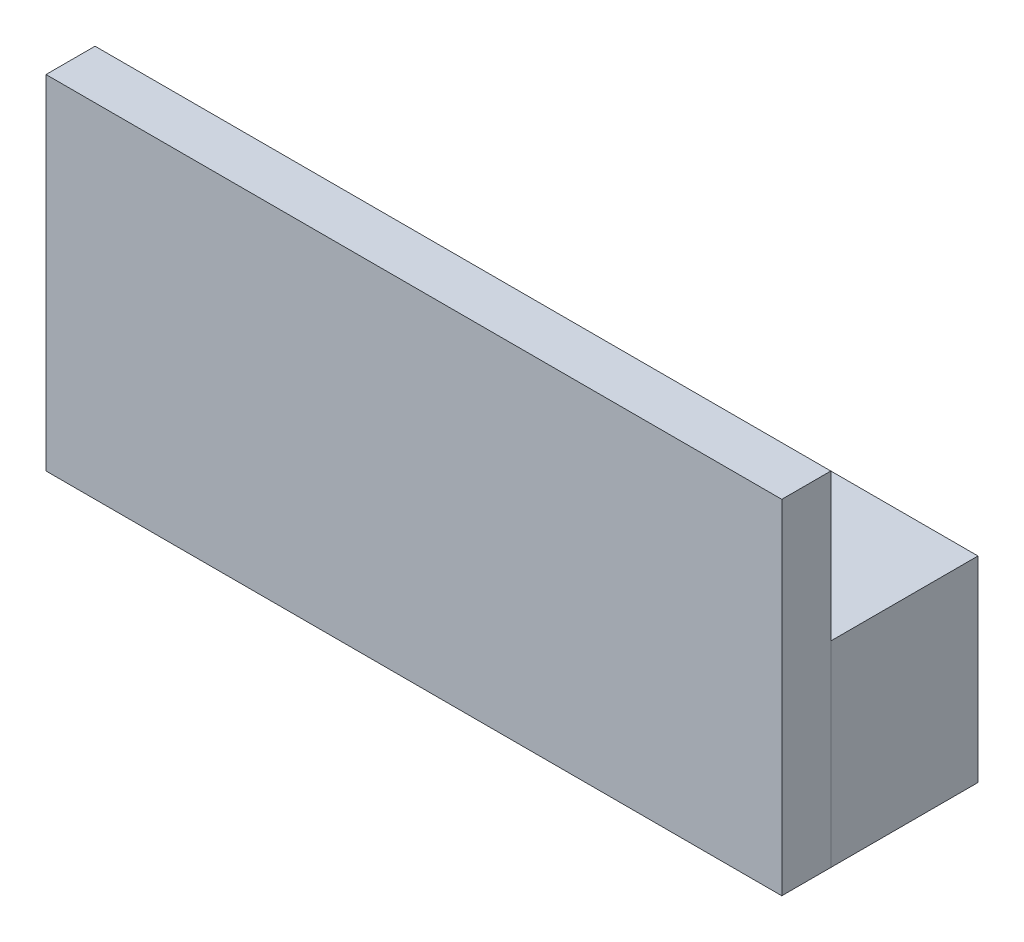
ISO-10303-21;
HEADER;
FILE_DESCRIPTION(('STEP AP214'),'2;1');
FILE_NAME('part.step','',(''),(''),'','','');
FILE_SCHEMA(('AUTOMOTIVE_DESIGN { 1 0 10303 214 1 1 1 1 }'));
ENDSEC;
DATA;
#1=APPLICATION_CONTEXT('core data for automotive mechanical design processes');
#2=APPLICATION_PROTOCOL_DEFINITION('international standard','automotive_design',2000,#1);
#3=PRODUCT_CONTEXT('',#1,'mechanical');
#4=PRODUCT('Part','Part','',(#3));
#5=PRODUCT_RELATED_PRODUCT_CATEGORY('part','',(#4));
#6=PRODUCT_DEFINITION_FORMATION('','',#4);
#7=PRODUCT_DEFINITION_CONTEXT('part definition',#1,'design');
#8=PRODUCT_DEFINITION('design','',#6,#7);
#9=PRODUCT_DEFINITION_SHAPE('','',#8);
#10=(LENGTH_UNIT() NAMED_UNIT(*) SI_UNIT(.MILLI.,.METRE.));
#11=(NAMED_UNIT(*) PLANE_ANGLE_UNIT() SI_UNIT($,.RADIAN.));
#12=(NAMED_UNIT(*) SI_UNIT($,.STERADIAN.) SOLID_ANGLE_UNIT());
#13=UNCERTAINTY_MEASURE_WITH_UNIT(LENGTH_MEASURE(1.E-05),#10,'distance_accuracy_value','');
#14=(GEOMETRIC_REPRESENTATION_CONTEXT(3) GLOBAL_UNCERTAINTY_ASSIGNED_CONTEXT((#13)) GLOBAL_UNIT_ASSIGNED_CONTEXT((#10,
#11,#12)) REPRESENTATION_CONTEXT('',''));
#15=CARTESIAN_POINT('',(0.,0.,0.));
#16=DIRECTION('',(0.,0.,1.));
#17=DIRECTION('',(1.,0.,0.));
#18=AXIS2_PLACEMENT_3D('',#15,#16,#17);
#19=CARTESIAN_POINT('',(10.,-10.,15.));
#20=DIRECTION('',(1.,0.,0.));
#21=DIRECTION('',(0.,1.,0.));
#22=AXIS2_PLACEMENT_3D('',#19,#20,#21);
#23=PLANE('',#22);
#24=DIRECTION('',(0.,1.,0.));
#25=VECTOR('',#24,1.);
#26=CARTESIAN_POINT('',(10.,-10.,20.));
#27=LINE('',#26,#25);
#28=CARTESIAN_POINT('',(10.,-10.,20.));
#29=VERTEX_POINT('',#28);
#30=CARTESIAN_POINT('',(10.,25.,20.));
#31=VERTEX_POINT('',#30);
#32=EDGE_CURVE('E115',#29,#31,#27,.T.);
#33=ORIENTED_EDGE('',*,*,#32,.F.);
#34=DIRECTION('',(0.,0.,1.));
#35=VECTOR('',#34,1.);
#36=CARTESIAN_POINT('',(10.,-10.,15.));
#37=LINE('',#36,#35);
#38=CARTESIAN_POINT('',(10.,-10.,15.));
#39=VERTEX_POINT('',#38);
#40=EDGE_CURVE('E12',#39,#29,#37,.T.);
#41=ORIENTED_EDGE('',*,*,#40,.F.);
#42=DIRECTION('',(0.,1.,0.));
#43=VECTOR('',#42,1.);
#44=CARTESIAN_POINT('',(10.,-10.,15.));
#45=LINE('',#44,#43);
#46=CARTESIAN_POINT('',(10.,25.,15.));
#47=VERTEX_POINT('',#46);
#48=EDGE_CURVE('E109',#39,#47,#45,.T.);
#49=ORIENTED_EDGE('',*,*,#48,.T.);
#50=DIRECTION('',(0.,0.,1.));
#51=VECTOR('',#50,1.);
#52=CARTESIAN_POINT('',(10.,25.,15.));
#53=LINE('',#52,#51);
#54=EDGE_CURVE('E54',#47,#31,#53,.T.);
#55=ORIENTED_EDGE('',*,*,#54,.T.);
#56=EDGE_LOOP('',(#33,#41,#49,#55));
#57=FACE_BOUND('',#56,.T.);
#58=ADVANCED_FACE('F51',(#57),#23,.T.);
#59=CARTESIAN_POINT('',(10.,-10.,15.));
#60=DIRECTION('',(0.,-1.,0.));
#61=DIRECTION('',(1.,0.,0.));
#62=AXIS2_PLACEMENT_3D('',#59,#60,#61);
#63=PLANE('',#62);
#64=DIRECTION('',(1.,0.,0.));
#65=VECTOR('',#64,1.);
#66=CARTESIAN_POINT('',(10.,-10.,20.));
#67=LINE('',#66,#65);
#68=CARTESIAN_POINT('',(-65.,-10.,20.));
#69=VERTEX_POINT('',#68);
#70=EDGE_CURVE('E111',#69,#29,#67,.T.);
#71=ORIENTED_EDGE('',*,*,#70,.F.);
#72=DIRECTION('',(0.,0.,1.));
#73=VECTOR('',#72,1.);
#74=CARTESIAN_POINT('',(-65.,-10.,15.));
#75=LINE('',#74,#73);
#76=CARTESIAN_POINT('',(-65.,-10.,15.));
#77=VERTEX_POINT('',#76);
#78=EDGE_CURVE('E60',#77,#69,#75,.T.);
#79=ORIENTED_EDGE('',*,*,#78,.F.);
#80=DIRECTION('',(1.,0.,0.));
#81=VECTOR('',#80,1.);
#82=CARTESIAN_POINT('',(10.,-10.,15.));
#83=LINE('',#82,#81);
#84=EDGE_CURVE('E106',#77,#39,#83,.T.);
#85=ORIENTED_EDGE('',*,*,#84,.T.);
#86=ORIENTED_EDGE('',*,*,#40,.T.);
#87=EDGE_LOOP('',(#71,#79,#85,#86));
#88=FACE_BOUND('',#87,.T.);
#89=ADVANCED_FACE('F125',(#88),#63,.T.);
#90=CARTESIAN_POINT('',(-65.,-10.,15.));
#91=DIRECTION('',(-1.,0.,0.));
#92=DIRECTION('',(0.,0.,1.));
#93=AXIS2_PLACEMENT_3D('',#90,#91,#92);
#94=PLANE('',#93);
#95=DIRECTION('',(0.,-1.,0.));
#96=VECTOR('',#95,1.);
#97=CARTESIAN_POINT('',(-65.,-10.,20.));
#98=LINE('',#97,#96);
#99=CARTESIAN_POINT('',(-65.,25.,20.));
#100=VERTEX_POINT('',#99);
#101=EDGE_CURVE('E101',#100,#69,#98,.T.);
#102=ORIENTED_EDGE('',*,*,#101,.F.);
#103=DIRECTION('',(0.,0.,1.));
#104=VECTOR('',#103,1.);
#105=CARTESIAN_POINT('',(-65.,25.,15.));
#106=LINE('',#105,#104);
#107=CARTESIAN_POINT('',(-65.,25.,15.));
#108=VERTEX_POINT('',#107);
#109=EDGE_CURVE('E96',#108,#100,#106,.T.);
#110=ORIENTED_EDGE('',*,*,#109,.F.);
#111=DIRECTION('',(0.,-1.,0.));
#112=VECTOR('',#111,1.);
#113=CARTESIAN_POINT('',(-65.,-10.,15.));
#114=LINE('',#113,#112);
#115=EDGE_CURVE('E99',#108,#77,#114,.T.);
#116=ORIENTED_EDGE('',*,*,#115,.T.);
#117=ORIENTED_EDGE('',*,*,#78,.T.);
#118=EDGE_LOOP('',(#102,#110,#116,#117));
#119=FACE_BOUND('',#118,.T.);
#120=ADVANCED_FACE('F98',(#119),#94,.T.);
#121=CARTESIAN_POINT('',(10.,25.,15.));
#122=DIRECTION('',(0.,1.,0.));
#123=DIRECTION('',(-1.,0.,0.));
#124=AXIS2_PLACEMENT_3D('',#121,#122,#123);
#125=PLANE('',#124);
#126=DIRECTION('',(-1.,0.,0.));
#127=VECTOR('',#126,1.);
#128=CARTESIAN_POINT('',(10.,25.,20.));
#129=LINE('',#128,#127);
#130=EDGE_CURVE('E118',#31,#100,#129,.T.);
#131=ORIENTED_EDGE('',*,*,#130,.F.);
#132=ORIENTED_EDGE('',*,*,#54,.F.);
#133=DIRECTION('',(-1.,0.,0.));
#134=VECTOR('',#133,1.);
#135=CARTESIAN_POINT('',(10.,25.,15.));
#136=LINE('',#135,#134);
#137=EDGE_CURVE('E105',#47,#108,#136,.T.);
#138=ORIENTED_EDGE('',*,*,#137,.T.);
#139=ORIENTED_EDGE('',*,*,#109,.T.);
#140=EDGE_LOOP('',(#131,#132,#138,#139));
#141=FACE_BOUND('',#140,.T.);
#142=ADVANCED_FACE('F108',(#141),#125,.T.);
#143=CARTESIAN_POINT('',(0.,0.,15.));
#144=DIRECTION('',(0.,0.,1.));
#145=DIRECTION('',(1.,0.,0.));
#146=AXIS2_PLACEMENT_3D('',#143,#144,#145);
#147=PLANE('',#146);
#148=ORIENTED_EDGE('',*,*,#48,.F.);
#149=ORIENTED_EDGE('',*,*,#84,.F.);
#150=ORIENTED_EDGE('',*,*,#115,.F.);
#151=ORIENTED_EDGE('',*,*,#137,.F.);
#152=EDGE_LOOP('',(#148,#149,#150,#151));
#153=FACE_BOUND('',#152,.T.);
#154=ADVANCED_FACE('F104',(#153),#147,.F.);
#155=CARTESIAN_POINT('',(0.,0.,20.));
#156=DIRECTION('',(0.,0.,1.));
#157=DIRECTION('',(1.,0.,0.));
#158=AXIS2_PLACEMENT_3D('',#155,#156,#157);
#159=PLANE('',#158);
#160=ORIENTED_EDGE('',*,*,#32,.T.);
#161=ORIENTED_EDGE('',*,*,#130,.T.);
#162=ORIENTED_EDGE('',*,*,#101,.T.);
#163=ORIENTED_EDGE('',*,*,#70,.T.);
#164=EDGE_LOOP('',(#160,#161,#162,#163));
#165=FACE_BOUND('',#164,.T.);
#166=ADVANCED_FACE('F124',(#165),#159,.T.);
#167=CLOSED_SHELL('',(#58,#89,#120,#142,#154,#166));
#168=MANIFOLD_SOLID_BREP('B2',#167);
#169=CARTESIAN_POINT('',(10.,-10.,10.));
#170=DIRECTION('',(-1.,0.,0.));
#171=DIRECTION('',(0.,0.,1.));
#172=AXIS2_PLACEMENT_3D('',#169,#170,#171);
#173=PLANE('',#172);
#174=DIRECTION('',(0.,1.,0.));
#175=VECTOR('',#174,1.);
#176=CARTESIAN_POINT('',(10.,-10.,0.));
#177=LINE('',#176,#175);
#178=CARTESIAN_POINT('',(10.,-10.,0.));
#179=VERTEX_POINT('',#178);
#180=CARTESIAN_POINT('',(10.,10.,0.));
#181=VERTEX_POINT('',#180);
#182=EDGE_CURVE('E243',#179,#181,#177,.T.);
#183=ORIENTED_EDGE('',*,*,#182,.T.);
#184=DIRECTION('',(0.,0.,-1.));
#185=VECTOR('',#184,1.);
#186=CARTESIAN_POINT('',(10.,10.,10.));
#187=LINE('',#186,#185);
#188=CARTESIAN_POINT('',(10.,10.,15.));
#189=VERTEX_POINT('',#188);
#190=EDGE_CURVE('E49',#189,#181,#187,.T.);
#191=ORIENTED_EDGE('',*,*,#190,.F.);
#192=DIRECTION('',(0.,1.,0.));
#193=VECTOR('',#192,1.);
#194=CARTESIAN_POINT('',(10.,-10.,15.));
#195=LINE('',#194,#193);
#196=CARTESIAN_POINT('',(10.,-10.,15.));
#197=VERTEX_POINT('',#196);
#198=EDGE_CURVE('E225',#197,#189,#195,.T.);
#199=ORIENTED_EDGE('',*,*,#198,.F.);
#200=DIRECTION('',(0.,0.,-1.));
#201=VECTOR('',#200,1.);
#202=CARTESIAN_POINT('',(10.,-10.,10.));
#203=LINE('',#202,#201);
#204=EDGE_CURVE('E214',#197,#179,#203,.T.);
#205=ORIENTED_EDGE('',*,*,#204,.T.);
#206=EDGE_LOOP('',(#183,#191,#199,#205));
#207=FACE_BOUND('',#206,.T.);
#208=ADVANCED_FACE('F175',(#207),#173,.F.);
#209=CARTESIAN_POINT('',(-10.,10.,10.));
#210=DIRECTION('',(0.,-1.,0.));
#211=DIRECTION('',(0.,0.,-1.));
#212=AXIS2_PLACEMENT_3D('',#209,#210,#211);
#213=PLANE('',#212);
#214=DIRECTION('',(-1.,0.,0.));
#215=VECTOR('',#214,1.);
#216=CARTESIAN_POINT('',(-10.,10.,0.));
#217=LINE('',#216,#215);
#218=CARTESIAN_POINT('',(-10.,10.,0.));
#219=VERTEX_POINT('',#218);
#220=EDGE_CURVE('E247',#181,#219,#217,.T.);
#221=ORIENTED_EDGE('',*,*,#220,.T.);
#222=DIRECTION('',(0.,0.,-1.));
#223=VECTOR('',#222,1.);
#224=CARTESIAN_POINT('',(-10.,10.,10.));
#225=LINE('',#224,#223);
#226=CARTESIAN_POINT('',(-10.,10.,15.));
#227=VERTEX_POINT('',#226);
#228=EDGE_CURVE('E182',#227,#219,#225,.T.);
#229=ORIENTED_EDGE('',*,*,#228,.F.);
#230=DIRECTION('',(-1.,0.,0.));
#231=VECTOR('',#230,1.);
#232=CARTESIAN_POINT('',(10.,10.,15.));
#233=LINE('',#232,#231);
#234=EDGE_CURVE('E229',#189,#227,#233,.T.);
#235=ORIENTED_EDGE('',*,*,#234,.F.);
#236=ORIENTED_EDGE('',*,*,#190,.T.);
#237=EDGE_LOOP('',(#221,#229,#235,#236));
#238=FACE_BOUND('',#237,.T.);
#239=ADVANCED_FACE('F255',(#238),#213,.F.);
#240=CARTESIAN_POINT('',(-10.,-10.,10.));
#241=DIRECTION('',(1.,0.,0.));
#242=DIRECTION('',(0.,0.,-1.));
#243=AXIS2_PLACEMENT_3D('',#240,#241,#242);
#244=PLANE('',#243);
#245=CARTESIAN_POINT('',(-10.,0.,5.));
#246=DIRECTION('',(-1.,0.,0.));
#247=DIRECTION('',(0.,0.,1.));
#248=AXIS2_PLACEMENT_3D('',#245,#246,#247);
#249=CIRCLE('',#248,4.);
#250=CARTESIAN_POINT('',(-10.,0.,9.));
#251=VERTEX_POINT('',#250);
#252=EDGE_CURVE('E239',#251,#251,#249,.T.);
#253=ORIENTED_EDGE('',*,*,#252,.F.);
#254=EDGE_LOOP('',(#253));
#255=FACE_BOUND('',#254,.T.);
#256=DIRECTION('',(0.,-1.,0.));
#257=VECTOR('',#256,1.);
#258=CARTESIAN_POINT('',(-10.,-10.,0.));
#259=LINE('',#258,#257);
#260=CARTESIAN_POINT('',(-10.,-10.,0.));
#261=VERTEX_POINT('',#260);
#262=EDGE_CURVE('E197',#219,#261,#259,.T.);
#263=ORIENTED_EDGE('',*,*,#262,.T.);
#264=DIRECTION('',(0.,0.,-1.));
#265=VECTOR('',#264,1.);
#266=CARTESIAN_POINT('',(-10.,-10.,10.));
#267=LINE('',#266,#265);
#268=CARTESIAN_POINT('',(-10.,-10.,15.));
#269=VERTEX_POINT('',#268);
#270=EDGE_CURVE('E222',#269,#261,#267,.T.);
#271=ORIENTED_EDGE('',*,*,#270,.F.);
#272=DIRECTION('',(0.,-1.,0.));
#273=VECTOR('',#272,1.);
#274=CARTESIAN_POINT('',(-10.,10.,15.));
#275=LINE('',#274,#273);
#276=EDGE_CURVE('E234',#227,#269,#275,.T.);
#277=ORIENTED_EDGE('',*,*,#276,.F.);
#278=ORIENTED_EDGE('',*,*,#228,.T.);
#279=EDGE_LOOP('',(#263,#271,#277,#278));
#280=FACE_BOUND('',#279,.T.);
#281=ADVANCED_FACE('F251',(#255,#280),#244,.F.);
#282=CARTESIAN_POINT('',(-10.,-10.,10.));
#283=DIRECTION('',(0.,1.,0.));
#284=DIRECTION('',(0.,0.,1.));
#285=AXIS2_PLACEMENT_3D('',#282,#283,#284);
#286=PLANE('',#285);
#287=DIRECTION('',(1.,0.,0.));
#288=VECTOR('',#287,1.);
#289=CARTESIAN_POINT('',(-10.,-10.,0.));
#290=LINE('',#289,#288);
#291=EDGE_CURVE('E189',#261,#179,#290,.T.);
#292=ORIENTED_EDGE('',*,*,#291,.T.);
#293=ORIENTED_EDGE('',*,*,#204,.F.);
#294=DIRECTION('',(1.,0.,0.));
#295=VECTOR('',#294,1.);
#296=CARTESIAN_POINT('',(-10.,-10.,15.));
#297=LINE('',#296,#295);
#298=EDGE_CURVE('E218',#269,#197,#297,.T.);
#299=ORIENTED_EDGE('',*,*,#298,.F.);
#300=ORIENTED_EDGE('',*,*,#270,.T.);
#301=EDGE_LOOP('',(#292,#293,#299,#300));
#302=FACE_BOUND('',#301,.T.);
#303=ADVANCED_FACE('F216',(#302),#286,.F.);
#304=CARTESIAN_POINT('',(0.,0.,0.));
#305=DIRECTION('',(0.,0.,-1.));
#306=DIRECTION('',(-1.,0.,0.));
#307=AXIS2_PLACEMENT_3D('',#304,#305,#306);
#308=PLANE('',#307);
#309=ORIENTED_EDGE('',*,*,#182,.F.);
#310=ORIENTED_EDGE('',*,*,#291,.F.);
#311=ORIENTED_EDGE('',*,*,#262,.F.);
#312=ORIENTED_EDGE('',*,*,#220,.F.);
#313=EDGE_LOOP('',(#309,#310,#311,#312));
#314=FACE_BOUND('',#313,.T.);
#315=ADVANCED_FACE('F254',(#314),#308,.T.);
#316=CARTESIAN_POINT('',(5.,0.,5.));
#317=DIRECTION('',(-1.,0.,0.));
#318=DIRECTION('',(0.,0.,1.));
#319=AXIS2_PLACEMENT_3D('',#316,#317,#318);
#320=CYLINDRICAL_SURFACE('',#319,4.);
#321=CARTESIAN_POINT('',(5.,0.,5.));
#322=DIRECTION('',(-1.,0.,0.));
#323=DIRECTION('',(0.,0.,1.));
#324=AXIS2_PLACEMENT_3D('',#321,#322,#323);
#325=CIRCLE('',#324,4.);
#326=CARTESIAN_POINT('',(5.,0.,9.));
#327=VERTEX_POINT('',#326);
#328=EDGE_CURVE('E240',#327,#327,#325,.T.);
#329=ORIENTED_EDGE('',*,*,#328,.F.);
#330=EDGE_LOOP('',(#329));
#331=FACE_BOUND('',#330,.T.);
#332=ORIENTED_EDGE('',*,*,#252,.T.);
#333=EDGE_LOOP('',(#332));
#334=FACE_BOUND('',#333,.T.);
#335=ADVANCED_FACE('F268',(#331,#334),#320,.F.);
#336=CARTESIAN_POINT('',(5.,0.,5.));
#337=DIRECTION('',(-1.,0.,0.));
#338=DIRECTION('',(0.,0.,1.));
#339=AXIS2_PLACEMENT_3D('',#336,#337,#338);
#340=PLANE('',#339);
#341=ORIENTED_EDGE('',*,*,#328,.T.);
#342=EDGE_LOOP('',(#341));
#343=FACE_BOUND('',#342,.T.);
#344=ADVANCED_FACE('F271',(#343),#340,.T.);
#345=CARTESIAN_POINT('',(0.,0.,15.));
#346=DIRECTION('',(0.,0.,1.));
#347=DIRECTION('',(1.,0.,0.));
#348=AXIS2_PLACEMENT_3D('',#345,#346,#347);
#349=PLANE('',#348);
#350=ORIENTED_EDGE('',*,*,#298,.T.);
#351=ORIENTED_EDGE('',*,*,#198,.T.);
#352=ORIENTED_EDGE('',*,*,#234,.T.);
#353=ORIENTED_EDGE('',*,*,#276,.T.);
#354=EDGE_LOOP('',(#350,#351,#352,#353));
#355=FACE_BOUND('',#354,.T.);
#356=ADVANCED_FACE('F232',(#355),#349,.T.);
#357=CLOSED_SHELL('',(#208,#239,#281,#303,#315,#335,#344,#356));
#358=MANIFOLD_SOLID_BREP('B6',#357);
#359=ADVANCED_BREP_SHAPE_REPRESENTATION('',(#18,#168,#358),#14);
#360=SHAPE_DEFINITION_REPRESENTATION(#9,#359);
ENDSEC;
END-ISO-10303-21;
